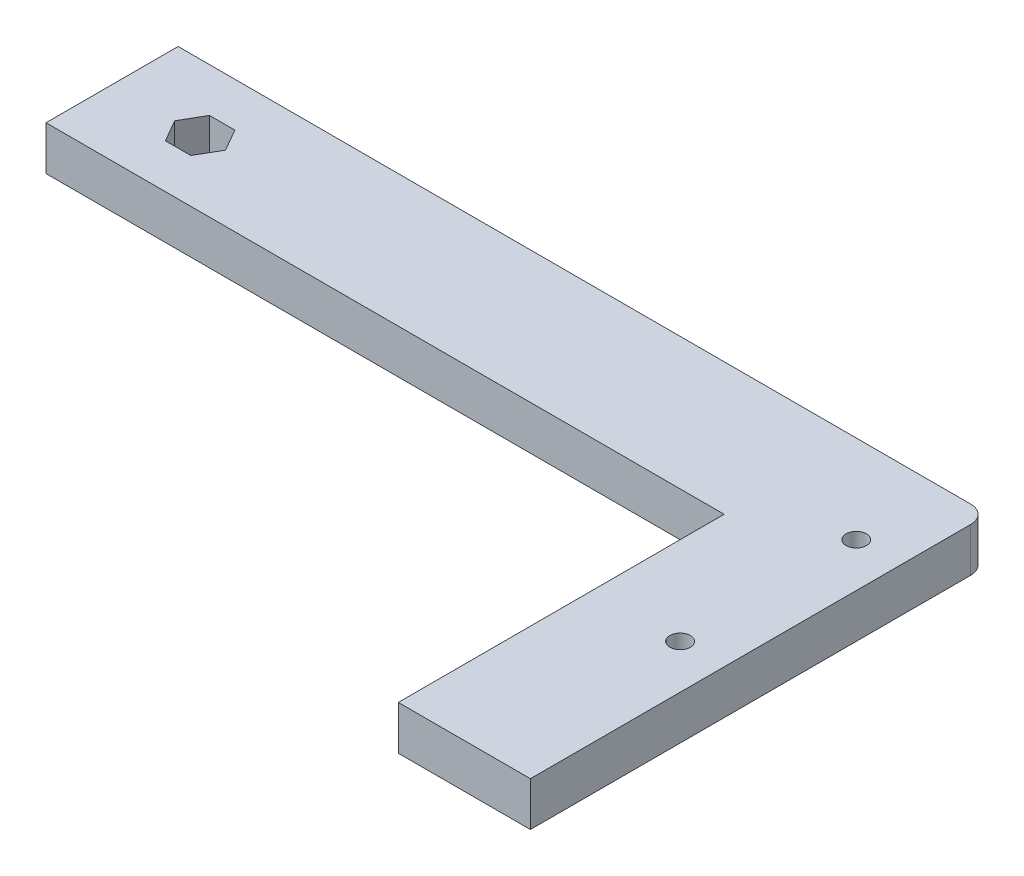
ISO-10303-21;
HEADER;
FILE_DESCRIPTION(('STEP AP214'),'2;1');
FILE_NAME('part.step','',(''),(''),'','','');
FILE_SCHEMA(('AUTOMOTIVE_DESIGN { 1 0 10303 214 1 1 1 1 }'));
ENDSEC;
DATA;
#1=APPLICATION_CONTEXT('core data for automotive mechanical design processes');
#2=APPLICATION_PROTOCOL_DEFINITION('international standard','automotive_design',2000,#1);
#3=PRODUCT_CONTEXT('',#1,'mechanical');
#4=PRODUCT('Part','Part','',(#3));
#5=PRODUCT_RELATED_PRODUCT_CATEGORY('part','',(#4));
#6=PRODUCT_DEFINITION_FORMATION('','',#4);
#7=PRODUCT_DEFINITION_CONTEXT('part definition',#1,'design');
#8=PRODUCT_DEFINITION('design','',#6,#7);
#9=PRODUCT_DEFINITION_SHAPE('','',#8);
#10=(LENGTH_UNIT() NAMED_UNIT(*) SI_UNIT(.MILLI.,.METRE.));
#11=(NAMED_UNIT(*) PLANE_ANGLE_UNIT() SI_UNIT($,.RADIAN.));
#12=(NAMED_UNIT(*) SI_UNIT($,.STERADIAN.) SOLID_ANGLE_UNIT());
#13=UNCERTAINTY_MEASURE_WITH_UNIT(LENGTH_MEASURE(1.E-05),#10,'distance_accuracy_value','');
#14=(GEOMETRIC_REPRESENTATION_CONTEXT(3) GLOBAL_UNCERTAINTY_ASSIGNED_CONTEXT((#13)) GLOBAL_UNIT_ASSIGNED_CONTEXT((#10,
#11,#12)) REPRESENTATION_CONTEXT('',''));
#15=CARTESIAN_POINT('',(0.,0.,0.));
#16=DIRECTION('',(0.,0.,1.));
#17=DIRECTION('',(1.,0.,0.));
#18=AXIS2_PLACEMENT_3D('',#15,#16,#17);
#19=CARTESIAN_POINT('',(0.,6.35,0.));
#20=DIRECTION('',(1.,0.,0.));
#21=DIRECTION('',(0.,0.,-1.));
#22=AXIS2_PLACEMENT_3D('',#19,#20,#21);
#23=PLANE('',#22);
#24=DIRECTION('',(0.,0.,1.));
#25=VECTOR('',#24,1.);
#26=CARTESIAN_POINT('',(0.,0.,0.));
#27=LINE('',#26,#25);
#28=CARTESIAN_POINT('',(0.,0.,0.));
#29=VERTEX_POINT('',#28);
#30=CARTESIAN_POINT('',(0.,0.,19.05));
#31=VERTEX_POINT('',#30);
#32=EDGE_CURVE('E198',#29,#31,#27,.T.);
#33=ORIENTED_EDGE('',*,*,#32,.T.);
#34=DIRECTION('',(0.,-1.,0.));
#35=VECTOR('',#34,1.);
#36=CARTESIAN_POINT('',(0.,6.35,19.05));
#37=LINE('',#36,#35);
#38=CARTESIAN_POINT('',(0.,6.35,19.05));
#39=VERTEX_POINT('',#38);
#40=EDGE_CURVE('E11',#39,#31,#37,.T.);
#41=ORIENTED_EDGE('',*,*,#40,.F.);
#42=DIRECTION('',(0.,0.,1.));
#43=VECTOR('',#42,1.);
#44=CARTESIAN_POINT('',(0.,6.35,0.));
#45=LINE('',#44,#43);
#46=CARTESIAN_POINT('',(0.,6.35,0.));
#47=VERTEX_POINT('',#46);
#48=EDGE_CURVE('E210',#47,#39,#45,.T.);
#49=ORIENTED_EDGE('',*,*,#48,.F.);
#50=DIRECTION('',(0.,-1.,0.));
#51=VECTOR('',#50,1.);
#52=CARTESIAN_POINT('',(0.,6.35,0.));
#53=LINE('',#52,#51);
#54=EDGE_CURVE('E233',#47,#29,#53,.T.);
#55=ORIENTED_EDGE('',*,*,#54,.T.);
#56=EDGE_LOOP('',(#33,#41,#49,#55));
#57=FACE_BOUND('',#56,.T.);
#58=ADVANCED_FACE('F40',(#57),#23,.F.);
#59=CARTESIAN_POINT('',(0.,6.35,19.05));
#60=DIRECTION('',(0.,0.,-1.));
#61=DIRECTION('',(-1.,0.,0.));
#62=AXIS2_PLACEMENT_3D('',#59,#60,#61);
#63=PLANE('',#62);
#64=DIRECTION('',(1.,0.,0.));
#65=VECTOR('',#64,1.);
#66=CARTESIAN_POINT('',(0.,0.,19.05));
#67=LINE('',#66,#65);
#68=CARTESIAN_POINT('',(97.7899999999999,0.,19.05));
#69=VERTEX_POINT('',#68);
#70=EDGE_CURVE('E237',#31,#69,#67,.T.);
#71=ORIENTED_EDGE('',*,*,#70,.T.);
#72=DIRECTION('',(0.,-1.,0.));
#73=VECTOR('',#72,1.);
#74=CARTESIAN_POINT('',(97.7899999999999,6.35,19.05));
#75=LINE('',#74,#73);
#76=CARTESIAN_POINT('',(97.7899999999999,6.35,19.05));
#77=VERTEX_POINT('',#76);
#78=EDGE_CURVE('E48',#77,#69,#75,.T.);
#79=ORIENTED_EDGE('',*,*,#78,.F.);
#80=DIRECTION('',(1.,0.,0.));
#81=VECTOR('',#80,1.);
#82=CARTESIAN_POINT('',(0.,6.35,19.05));
#83=LINE('',#82,#81);
#84=EDGE_CURVE('E214',#39,#77,#83,.T.);
#85=ORIENTED_EDGE('',*,*,#84,.F.);
#86=ORIENTED_EDGE('',*,*,#40,.T.);
#87=EDGE_LOOP('',(#71,#79,#85,#86));
#88=FACE_BOUND('',#87,.T.);
#89=ADVANCED_FACE('F299',(#88),#63,.F.);
#90=CARTESIAN_POINT('',(97.7899999999999,6.35,19.05));
#91=DIRECTION('',(1.,0.,0.));
#92=DIRECTION('',(0.,0.,-1.));
#93=AXIS2_PLACEMENT_3D('',#90,#91,#92);
#94=PLANE('',#93);
#95=DIRECTION('',(0.,0.,1.));
#96=VECTOR('',#95,1.);
#97=CARTESIAN_POINT('',(97.7899999999999,0.,19.05));
#98=LINE('',#97,#96);
#99=CARTESIAN_POINT('',(97.7899999999998,0.,66.04));
#100=VERTEX_POINT('',#99);
#101=EDGE_CURVE('E240',#69,#100,#98,.T.);
#102=ORIENTED_EDGE('',*,*,#101,.T.);
#103=DIRECTION('',(0.,-1.,0.));
#104=VECTOR('',#103,1.);
#105=CARTESIAN_POINT('',(97.7899999999998,6.35,66.04));
#106=LINE('',#105,#104);
#107=CARTESIAN_POINT('',(97.7899999999998,6.35,66.04));
#108=VERTEX_POINT('',#107);
#109=EDGE_CURVE('E269',#108,#100,#106,.T.);
#110=ORIENTED_EDGE('',*,*,#109,.F.);
#111=DIRECTION('',(0.,0.,1.));
#112=VECTOR('',#111,1.);
#113=CARTESIAN_POINT('',(97.7899999999999,6.35,19.05));
#114=LINE('',#113,#112);
#115=EDGE_CURVE('E218',#77,#108,#114,.T.);
#116=ORIENTED_EDGE('',*,*,#115,.F.);
#117=ORIENTED_EDGE('',*,*,#78,.T.);
#118=EDGE_LOOP('',(#102,#110,#116,#117));
#119=FACE_BOUND('',#118,.T.);
#120=ADVANCED_FACE('F278',(#119),#94,.F.);
#121=CARTESIAN_POINT('',(97.7899999999998,6.35,66.04));
#122=DIRECTION('',(0.,0.,-1.));
#123=DIRECTION('',(-1.,0.,0.));
#124=AXIS2_PLACEMENT_3D('',#121,#122,#123);
#125=PLANE('',#124);
#126=DIRECTION('',(1.,0.,0.));
#127=VECTOR('',#126,1.);
#128=CARTESIAN_POINT('',(97.7899999999998,0.,66.04));
#129=LINE('',#128,#127);
#130=CARTESIAN_POINT('',(116.84,0.,66.04));
#131=VERTEX_POINT('',#130);
#132=EDGE_CURVE('E243',#100,#131,#129,.T.);
#133=ORIENTED_EDGE('',*,*,#132,.T.);
#134=DIRECTION('',(0.,-1.,0.));
#135=VECTOR('',#134,1.);
#136=CARTESIAN_POINT('',(116.84,6.35,66.04));
#137=LINE('',#136,#135);
#138=CARTESIAN_POINT('',(116.84,6.35,66.04));
#139=VERTEX_POINT('',#138);
#140=EDGE_CURVE('E265',#139,#131,#137,.T.);
#141=ORIENTED_EDGE('',*,*,#140,.F.);
#142=DIRECTION('',(1.,0.,0.));
#143=VECTOR('',#142,1.);
#144=CARTESIAN_POINT('',(97.7899999999998,6.35,66.04));
#145=LINE('',#144,#143);
#146=EDGE_CURVE('E221',#108,#139,#145,.T.);
#147=ORIENTED_EDGE('',*,*,#146,.F.);
#148=ORIENTED_EDGE('',*,*,#109,.T.);
#149=EDGE_LOOP('',(#133,#141,#147,#148));
#150=FACE_BOUND('',#149,.T.);
#151=ADVANCED_FACE('F287',(#150),#125,.F.);
#152=CARTESIAN_POINT('',(116.84,6.35,2.54000000000001));
#153=DIRECTION('',(-1.,0.,0.));
#154=DIRECTION('',(0.,0.,1.));
#155=AXIS2_PLACEMENT_3D('',#152,#153,#154);
#156=PLANE('',#155);
#157=DIRECTION('',(0.,0.,-1.));
#158=VECTOR('',#157,1.);
#159=CARTESIAN_POINT('',(116.84,0.,2.54000000000001));
#160=LINE('',#159,#158);
#161=CARTESIAN_POINT('',(116.84,0.,2.54000000000001));
#162=VERTEX_POINT('',#161);
#163=EDGE_CURVE('E246',#131,#162,#160,.T.);
#164=ORIENTED_EDGE('',*,*,#163,.T.);
#165=DIRECTION('',(0.,-1.,0.));
#166=VECTOR('',#165,1.);
#167=CARTESIAN_POINT('',(116.84,6.35,2.54000000000001));
#168=LINE('',#167,#166);
#169=CARTESIAN_POINT('',(116.84,6.35,2.54000000000001));
#170=VERTEX_POINT('',#169);
#171=EDGE_CURVE('E261',#170,#162,#168,.T.);
#172=ORIENTED_EDGE('',*,*,#171,.F.);
#173=DIRECTION('',(0.,0.,-1.));
#174=VECTOR('',#173,1.);
#175=CARTESIAN_POINT('',(116.84,6.35,2.54000000000001));
#176=LINE('',#175,#174);
#177=EDGE_CURVE('E224',#139,#170,#176,.T.);
#178=ORIENTED_EDGE('',*,*,#177,.F.);
#179=ORIENTED_EDGE('',*,*,#140,.T.);
#180=EDGE_LOOP('',(#164,#172,#178,#179));
#181=FACE_BOUND('',#180,.T.);
#182=ADVANCED_FACE('F291',(#181),#156,.F.);
#183=CARTESIAN_POINT('',(114.3,6.35,2.54));
#184=DIRECTION('',(0.,-1.,0.));
#185=DIRECTION('',(0.,0.,-1.));
#186=AXIS2_PLACEMENT_3D('',#183,#184,#185);
#187=CYLINDRICAL_SURFACE('',#186,2.54);
#188=CARTESIAN_POINT('',(114.3,0.,2.54));
#189=DIRECTION('',(0.,1.,0.));
#190=DIRECTION('',(0.,0.,-1.));
#191=AXIS2_PLACEMENT_3D('',#188,#189,#190);
#192=CIRCLE('',#191,2.54);
#193=CARTESIAN_POINT('',(114.3,0.,0.));
#194=VERTEX_POINT('',#193);
#195=EDGE_CURVE('E249',#162,#194,#192,.T.);
#196=ORIENTED_EDGE('',*,*,#195,.T.);
#197=DIRECTION('',(0.,-1.,0.));
#198=VECTOR('',#197,1.);
#199=CARTESIAN_POINT('',(114.3,6.35,0.));
#200=LINE('',#199,#198);
#201=CARTESIAN_POINT('',(114.3,6.35,0.));
#202=VERTEX_POINT('',#201);
#203=EDGE_CURVE('E257',#202,#194,#200,.T.);
#204=ORIENTED_EDGE('',*,*,#203,.F.);
#205=CARTESIAN_POINT('',(114.3,6.35,2.54));
#206=DIRECTION('',(0.,1.,0.));
#207=DIRECTION('',(0.,0.,-1.));
#208=AXIS2_PLACEMENT_3D('',#205,#206,#207);
#209=CIRCLE('',#208,2.54);
#210=EDGE_CURVE('E227',#170,#202,#209,.T.);
#211=ORIENTED_EDGE('',*,*,#210,.F.);
#212=ORIENTED_EDGE('',*,*,#171,.T.);
#213=EDGE_LOOP('',(#196,#204,#211,#212));
#214=FACE_BOUND('',#213,.T.);
#215=ADVANCED_FACE('F307',(#214),#187,.T.);
#216=CARTESIAN_POINT('',(0.,6.35,0.));
#217=DIRECTION('',(0.,0.,1.));
#218=DIRECTION('',(1.,0.,0.));
#219=AXIS2_PLACEMENT_3D('',#216,#217,#218);
#220=PLANE('',#219);
#221=DIRECTION('',(-1.,0.,0.));
#222=VECTOR('',#221,1.);
#223=CARTESIAN_POINT('',(0.,0.,0.));
#224=LINE('',#223,#222);
#225=EDGE_CURVE('E215',#194,#29,#224,.T.);
#226=ORIENTED_EDGE('',*,*,#225,.T.);
#227=ORIENTED_EDGE('',*,*,#54,.F.);
#228=DIRECTION('',(-1.,0.,0.));
#229=VECTOR('',#228,1.);
#230=CARTESIAN_POINT('',(0.,6.35,0.));
#231=LINE('',#230,#229);
#232=EDGE_CURVE('E230',#202,#47,#231,.T.);
#233=ORIENTED_EDGE('',*,*,#232,.F.);
#234=ORIENTED_EDGE('',*,*,#203,.T.);
#235=EDGE_LOOP('',(#226,#227,#233,#234));
#236=FACE_BOUND('',#235,.T.);
#237=ADVANCED_FACE('F304',(#236),#220,.F.);
#238=CARTESIAN_POINT('',(114.3,6.35,2.54));
#239=DIRECTION('',(0.,-1.,0.));
#240=DIRECTION('',(0.,0.,-1.));
#241=AXIS2_PLACEMENT_3D('',#238,#239,#240);
#242=PLANE('',#241);
#243=CARTESIAN_POINT('',(110.49,6.35,38.1));
#244=DIRECTION('',(0.,-1.,0.));
#245=DIRECTION('',(0.,0.,-1.));
#246=AXIS2_PLACEMENT_3D('',#243,#244,#245);
#247=CIRCLE('',#246,1.47320000000001);
#248=CARTESIAN_POINT('',(110.49,6.35,36.6268));
#249=VERTEX_POINT('',#248);
#250=EDGE_CURVE('E181',#249,#249,#247,.T.);
#251=ORIENTED_EDGE('',*,*,#250,.T.);
#252=EDGE_LOOP('',(#251));
#253=FACE_BOUND('',#252,.T.);
#254=CARTESIAN_POINT('',(110.49,6.35,12.7));
#255=DIRECTION('',(0.,-1.,0.));
#256=DIRECTION('',(0.,0.,-1.));
#257=AXIS2_PLACEMENT_3D('',#254,#255,#256);
#258=CIRCLE('',#257,1.47320000000001);
#259=CARTESIAN_POINT('',(110.49,6.35,11.2268));
#260=VERTEX_POINT('',#259);
#261=EDGE_CURVE('E448',#260,#260,#258,.T.);
#262=ORIENTED_EDGE('',*,*,#261,.T.);
#263=EDGE_LOOP('',(#262));
#264=FACE_BOUND('',#263,.T.);
#265=DIRECTION('',(0.5,0.,-0.866025403784439));
#266=VECTOR('',#265,1.);
#267=CARTESIAN_POINT('',(14.5330871046771,6.35,12.7));
#268=LINE('',#267,#266);
#269=CARTESIAN_POINT('',(14.5330871046771,6.35,12.7));
#270=VERTEX_POINT('',#269);
#271=CARTESIAN_POINT('',(16.3661742093541,6.35,9.525));
#272=VERTEX_POINT('',#271);
#273=EDGE_CURVE('E180',#270,#272,#268,.T.);
#274=ORIENTED_EDGE('',*,*,#273,.F.);
#275=DIRECTION('',(1.,0.,0.));
#276=VECTOR('',#275,1.);
#277=CARTESIAN_POINT('',(10.8669128953229,6.35,12.7));
#278=LINE('',#277,#276);
#279=CARTESIAN_POINT('',(10.8669128953229,6.35,12.7));
#280=VERTEX_POINT('',#279);
#281=EDGE_CURVE('E55',#280,#270,#278,.T.);
#282=ORIENTED_EDGE('',*,*,#281,.F.);
#283=DIRECTION('',(0.5,0.,0.866025403784439));
#284=VECTOR('',#283,1.);
#285=CARTESIAN_POINT('',(9.03382579064588,6.35,9.525));
#286=LINE('',#285,#284);
#287=CARTESIAN_POINT('',(9.03382579064588,6.35,9.525));
#288=VERTEX_POINT('',#287);
#289=EDGE_CURVE('E157',#288,#280,#286,.T.);
#290=ORIENTED_EDGE('',*,*,#289,.F.);
#291=DIRECTION('',(-0.5,0.,0.866025403784439));
#292=VECTOR('',#291,1.);
#293=CARTESIAN_POINT('',(10.8669128953229,6.35,6.35));
#294=LINE('',#293,#292);
#295=CARTESIAN_POINT('',(10.8669128953229,6.35,6.35));
#296=VERTEX_POINT('',#295);
#297=EDGE_CURVE('E161',#296,#288,#294,.T.);
#298=ORIENTED_EDGE('',*,*,#297,.F.);
#299=DIRECTION('',(-1.,0.,0.));
#300=VECTOR('',#299,1.);
#301=CARTESIAN_POINT('',(14.5330871046771,6.35,6.35));
#302=LINE('',#301,#300);
#303=CARTESIAN_POINT('',(14.5330871046771,6.35,6.35));
#304=VERTEX_POINT('',#303);
#305=EDGE_CURVE('E188',#304,#296,#302,.T.);
#306=ORIENTED_EDGE('',*,*,#305,.F.);
#307=DIRECTION('',(-0.5,0.,-0.866025403784439));
#308=VECTOR('',#307,1.);
#309=CARTESIAN_POINT('',(16.3661742093541,6.35,9.525));
#310=LINE('',#309,#308);
#311=EDGE_CURVE('E184',#272,#304,#310,.T.);
#312=ORIENTED_EDGE('',*,*,#311,.F.);
#313=EDGE_LOOP('',(#274,#282,#290,#298,#306,#312));
#314=FACE_BOUND('',#313,.T.);
#315=ORIENTED_EDGE('',*,*,#48,.T.);
#316=ORIENTED_EDGE('',*,*,#84,.T.);
#317=ORIENTED_EDGE('',*,*,#115,.T.);
#318=ORIENTED_EDGE('',*,*,#146,.T.);
#319=ORIENTED_EDGE('',*,*,#177,.T.);
#320=ORIENTED_EDGE('',*,*,#210,.T.);
#321=ORIENTED_EDGE('',*,*,#232,.T.);
#322=EDGE_LOOP('',(#315,#316,#317,#318,#319,#320,#321));
#323=FACE_BOUND('',#322,.T.);
#324=ADVANCED_FACE('F295',(#253,#264,#314,#323),#242,.F.);
#325=CARTESIAN_POINT('',(114.3,0.,2.54));
#326=DIRECTION('',(0.,-1.,0.));
#327=DIRECTION('',(0.,0.,-1.));
#328=AXIS2_PLACEMENT_3D('',#325,#326,#327);
#329=PLANE('',#328);
#330=CARTESIAN_POINT('',(110.49,0.,38.1));
#331=DIRECTION('',(0.,-1.,0.));
#332=DIRECTION('',(0.,0.,-1.));
#333=AXIS2_PLACEMENT_3D('',#330,#331,#332);
#334=CIRCLE('',#333,1.47320000000001);
#335=CARTESIAN_POINT('',(110.49,0.,36.6268));
#336=VERTEX_POINT('',#335);
#337=EDGE_CURVE('E446',#336,#336,#334,.T.);
#338=ORIENTED_EDGE('',*,*,#337,.F.);
#339=EDGE_LOOP('',(#338));
#340=FACE_BOUND('',#339,.T.);
#341=CARTESIAN_POINT('',(110.49,0.,12.7));
#342=DIRECTION('',(0.,-1.,0.));
#343=DIRECTION('',(0.,0.,-1.));
#344=AXIS2_PLACEMENT_3D('',#341,#342,#343);
#345=CIRCLE('',#344,1.47320000000001);
#346=CARTESIAN_POINT('',(110.49,0.,11.2268));
#347=VERTEX_POINT('',#346);
#348=EDGE_CURVE('E164',#347,#347,#345,.T.);
#349=ORIENTED_EDGE('',*,*,#348,.F.);
#350=EDGE_LOOP('',(#349));
#351=FACE_BOUND('',#350,.T.);
#352=DIRECTION('',(1.,0.,0.));
#353=VECTOR('',#352,1.);
#354=CARTESIAN_POINT('',(10.8669128953229,0.,12.7));
#355=LINE('',#354,#353);
#356=CARTESIAN_POINT('',(10.8669128953229,0.,12.7));
#357=VERTEX_POINT('',#356);
#358=CARTESIAN_POINT('',(14.5330871046771,0.,12.7));
#359=VERTEX_POINT('',#358);
#360=EDGE_CURVE('E137',#357,#359,#355,.T.);
#361=ORIENTED_EDGE('',*,*,#360,.T.);
#362=DIRECTION('',(0.5,0.,-0.866025403784439));
#363=VECTOR('',#362,1.);
#364=CARTESIAN_POINT('',(14.5330871046771,0.,12.7));
#365=LINE('',#364,#363);
#366=CARTESIAN_POINT('',(16.3661742093541,0.,9.52500000000001));
#367=VERTEX_POINT('',#366);
#368=EDGE_CURVE('E147',#359,#367,#365,.T.);
#369=ORIENTED_EDGE('',*,*,#368,.T.);
#370=DIRECTION('',(-0.5,0.,-0.866025403784439));
#371=VECTOR('',#370,1.);
#372=CARTESIAN_POINT('',(16.3661742093541,0.,9.525));
#373=LINE('',#372,#371);
#374=CARTESIAN_POINT('',(14.5330871046771,0.,6.35));
#375=VERTEX_POINT('',#374);
#376=EDGE_CURVE('E63',#367,#375,#373,.T.);
#377=ORIENTED_EDGE('',*,*,#376,.T.);
#378=DIRECTION('',(-1.,0.,0.));
#379=VECTOR('',#378,1.);
#380=CARTESIAN_POINT('',(14.5330871046771,0.,6.35));
#381=LINE('',#380,#379);
#382=CARTESIAN_POINT('',(10.8669128953229,0.,6.35));
#383=VERTEX_POINT('',#382);
#384=EDGE_CURVE('E169',#375,#383,#381,.T.);
#385=ORIENTED_EDGE('',*,*,#384,.T.);
#386=DIRECTION('',(-0.5,0.,0.866025403784439));
#387=VECTOR('',#386,1.);
#388=CARTESIAN_POINT('',(10.8669128953229,0.,6.35));
#389=LINE('',#388,#387);
#390=CARTESIAN_POINT('',(9.03382579064588,0.,9.525));
#391=VERTEX_POINT('',#390);
#392=EDGE_CURVE('E173',#383,#391,#389,.T.);
#393=ORIENTED_EDGE('',*,*,#392,.T.);
#394=DIRECTION('',(0.5,0.,0.866025403784439));
#395=VECTOR('',#394,1.);
#396=CARTESIAN_POINT('',(9.03382579064588,0.,9.525));
#397=LINE('',#396,#395);
#398=EDGE_CURVE('E144',#391,#357,#397,.T.);
#399=ORIENTED_EDGE('',*,*,#398,.T.);
#400=EDGE_LOOP('',(#361,#369,#377,#385,#393,#399));
#401=FACE_BOUND('',#400,.T.);
#402=ORIENTED_EDGE('',*,*,#32,.F.);
#403=ORIENTED_EDGE('',*,*,#225,.F.);
#404=ORIENTED_EDGE('',*,*,#195,.F.);
#405=ORIENTED_EDGE('',*,*,#163,.F.);
#406=ORIENTED_EDGE('',*,*,#132,.F.);
#407=ORIENTED_EDGE('',*,*,#101,.F.);
#408=ORIENTED_EDGE('',*,*,#70,.F.);
#409=EDGE_LOOP('',(#402,#403,#404,#405,#406,#407,#408));
#410=FACE_BOUND('',#409,.T.);
#411=ADVANCED_FACE('F152',(#340,#351,#401,#410),#329,.T.);
#412=CARTESIAN_POINT('',(10.8669128953229,0.,12.7));
#413=DIRECTION('',(0.,0.,1.));
#414=DIRECTION('',(1.,0.,0.));
#415=AXIS2_PLACEMENT_3D('',#412,#413,#414);
#416=PLANE('',#415);
#417=ORIENTED_EDGE('',*,*,#281,.T.);
#418=DIRECTION('',(0.,1.,0.));
#419=VECTOR('',#418,1.);
#420=CARTESIAN_POINT('',(14.5330871046771,0.,12.7));
#421=LINE('',#420,#419);
#422=EDGE_CURVE('E133',#359,#270,#421,.T.);
#423=ORIENTED_EDGE('',*,*,#422,.F.);
#424=ORIENTED_EDGE('',*,*,#360,.F.);
#425=DIRECTION('',(0.,1.,0.));
#426=VECTOR('',#425,1.);
#427=CARTESIAN_POINT('',(10.8669128953229,0.,12.7));
#428=LINE('',#427,#426);
#429=EDGE_CURVE('E195',#357,#280,#428,.T.);
#430=ORIENTED_EDGE('',*,*,#429,.T.);
#431=EDGE_LOOP('',(#417,#423,#424,#430));
#432=FACE_BOUND('',#431,.T.);
#433=ADVANCED_FACE('F135',(#432),#416,.F.);
#434=CARTESIAN_POINT('',(9.03382579064588,0.,9.525));
#435=DIRECTION('',(-0.866025403784439,0.,0.5));
#436=DIRECTION('',(0.5,0.,0.866025403784439));
#437=AXIS2_PLACEMENT_3D('',#434,#435,#436);
#438=PLANE('',#437);
#439=ORIENTED_EDGE('',*,*,#289,.T.);
#440=ORIENTED_EDGE('',*,*,#429,.F.);
#441=ORIENTED_EDGE('',*,*,#398,.F.);
#442=DIRECTION('',(0.,1.,0.));
#443=VECTOR('',#442,1.);
#444=CARTESIAN_POINT('',(9.03382579064588,0.,9.525));
#445=LINE('',#444,#443);
#446=EDGE_CURVE('E199',#391,#288,#445,.T.);
#447=ORIENTED_EDGE('',*,*,#446,.T.);
#448=EDGE_LOOP('',(#439,#440,#441,#447));
#449=FACE_BOUND('',#448,.T.);
#450=ADVANCED_FACE('F355',(#449),#438,.F.);
#451=CARTESIAN_POINT('',(10.8669128953229,0.,6.35));
#452=DIRECTION('',(-0.866025403784438,0.,-0.5));
#453=DIRECTION('',(-0.5,0.,0.866025403784439));
#454=AXIS2_PLACEMENT_3D('',#451,#452,#453);
#455=PLANE('',#454);
#456=ORIENTED_EDGE('',*,*,#297,.T.);
#457=ORIENTED_EDGE('',*,*,#446,.F.);
#458=ORIENTED_EDGE('',*,*,#392,.F.);
#459=DIRECTION('',(0.,1.,0.));
#460=VECTOR('',#459,1.);
#461=CARTESIAN_POINT('',(10.8669128953229,0.,6.35));
#462=LINE('',#461,#460);
#463=EDGE_CURVE('E202',#383,#296,#462,.T.);
#464=ORIENTED_EDGE('',*,*,#463,.T.);
#465=EDGE_LOOP('',(#456,#457,#458,#464));
#466=FACE_BOUND('',#465,.T.);
#467=ADVANCED_FACE('F366',(#466),#455,.F.);
#468=CARTESIAN_POINT('',(14.5330871046771,0.,6.35));
#469=DIRECTION('',(0.,0.,-1.));
#470=DIRECTION('',(-1.,0.,0.));
#471=AXIS2_PLACEMENT_3D('',#468,#469,#470);
#472=PLANE('',#471);
#473=ORIENTED_EDGE('',*,*,#305,.T.);
#474=ORIENTED_EDGE('',*,*,#463,.F.);
#475=ORIENTED_EDGE('',*,*,#384,.F.);
#476=DIRECTION('',(0.,1.,0.));
#477=VECTOR('',#476,1.);
#478=CARTESIAN_POINT('',(14.5330871046771,0.,6.35));
#479=LINE('',#478,#477);
#480=EDGE_CURVE('E205',#375,#304,#479,.T.);
#481=ORIENTED_EDGE('',*,*,#480,.T.);
#482=EDGE_LOOP('',(#473,#474,#475,#481));
#483=FACE_BOUND('',#482,.T.);
#484=ADVANCED_FACE('F376',(#483),#472,.F.);
#485=CARTESIAN_POINT('',(16.3661742093541,0.,9.525));
#486=DIRECTION('',(0.866025403784439,0.,-0.5));
#487=DIRECTION('',(-0.5,0.,-0.866025403784439));
#488=AXIS2_PLACEMENT_3D('',#485,#486,#487);
#489=PLANE('',#488);
#490=ORIENTED_EDGE('',*,*,#311,.T.);
#491=ORIENTED_EDGE('',*,*,#480,.F.);
#492=ORIENTED_EDGE('',*,*,#376,.F.);
#493=DIRECTION('',(0.,1.,0.));
#494=VECTOR('',#493,1.);
#495=CARTESIAN_POINT('',(16.3661742093541,0.,9.525));
#496=LINE('',#495,#494);
#497=EDGE_CURVE('E143',#367,#272,#496,.T.);
#498=ORIENTED_EDGE('',*,*,#497,.T.);
#499=EDGE_LOOP('',(#490,#491,#492,#498));
#500=FACE_BOUND('',#499,.T.);
#501=ADVANCED_FACE('F386',(#500),#489,.F.);
#502=CARTESIAN_POINT('',(14.5330871046771,0.,12.7));
#503=DIRECTION('',(0.866025403784439,0.,0.5));
#504=DIRECTION('',(0.5,0.,-0.866025403784439));
#505=AXIS2_PLACEMENT_3D('',#502,#503,#504);
#506=PLANE('',#505);
#507=ORIENTED_EDGE('',*,*,#273,.T.);
#508=ORIENTED_EDGE('',*,*,#497,.F.);
#509=ORIENTED_EDGE('',*,*,#368,.F.);
#510=ORIENTED_EDGE('',*,*,#422,.T.);
#511=EDGE_LOOP('',(#507,#508,#509,#510));
#512=FACE_BOUND('',#511,.T.);
#513=ADVANCED_FACE('F148',(#512),#506,.F.);
#514=CARTESIAN_POINT('',(110.49,6.35,12.7));
#515=DIRECTION('',(0.,-1.,0.));
#516=DIRECTION('',(0.,0.,-1.));
#517=AXIS2_PLACEMENT_3D('',#514,#515,#516);
#518=CYLINDRICAL_SURFACE('',#517,1.47320000000001);
#519=ORIENTED_EDGE('',*,*,#261,.F.);
#520=EDGE_LOOP('',(#519));
#521=FACE_BOUND('',#520,.T.);
#522=ORIENTED_EDGE('',*,*,#348,.T.);
#523=EDGE_LOOP('',(#522));
#524=FACE_BOUND('',#523,.T.);
#525=ADVANCED_FACE('F404',(#521,#524),#518,.F.);
#526=CARTESIAN_POINT('',(110.49,6.35,38.1));
#527=DIRECTION('',(0.,-1.,0.));
#528=DIRECTION('',(0.,0.,-1.));
#529=AXIS2_PLACEMENT_3D('',#526,#527,#528);
#530=CYLINDRICAL_SURFACE('',#529,1.47320000000001);
#531=ORIENTED_EDGE('',*,*,#250,.F.);
#532=EDGE_LOOP('',(#531));
#533=FACE_BOUND('',#532,.T.);
#534=ORIENTED_EDGE('',*,*,#337,.T.);
#535=EDGE_LOOP('',(#534));
#536=FACE_BOUND('',#535,.T.);
#537=ADVANCED_FACE('F427',(#533,#536),#530,.F.);
#538=CLOSED_SHELL('',(#58,#89,#120,#151,#182,#215,#237,#324,#411,#433,#450,#467,#484,#501,#513,
#525,#537));
#539=MANIFOLD_SOLID_BREP('B2',#538);
#540=ADVANCED_BREP_SHAPE_REPRESENTATION('',(#18,#539),#14);
#541=SHAPE_DEFINITION_REPRESENTATION(#9,#540);
ENDSEC;
END-ISO-10303-21;
